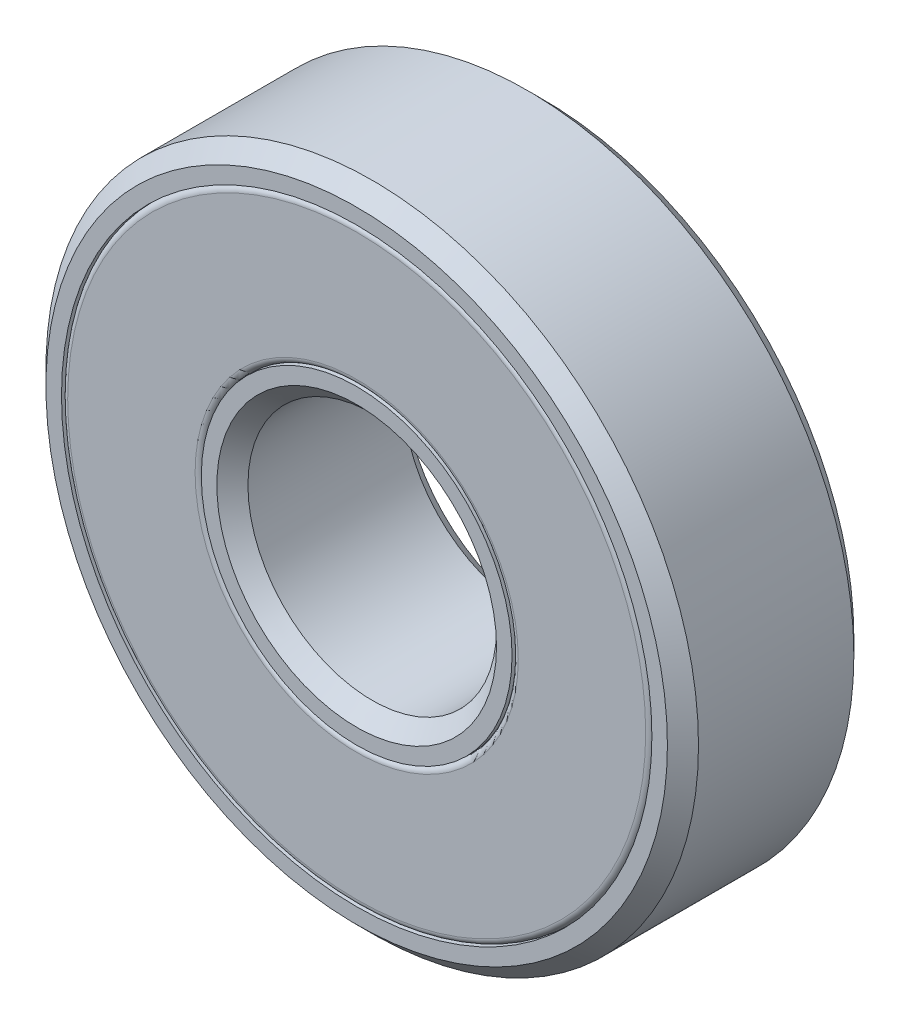
ISO-10303-21;
HEADER;
FILE_DESCRIPTION(('STEP AP214'),'2;1');
FILE_NAME('part.step','',(''),(''),'','','');
FILE_SCHEMA(('AUTOMOTIVE_DESIGN { 1 0 10303 214 1 1 1 1 }'));
ENDSEC;
DATA;
#1=APPLICATION_CONTEXT('core data for automotive mechanical design processes');
#2=APPLICATION_PROTOCOL_DEFINITION('international standard','automotive_design',2000,#1);
#3=PRODUCT_CONTEXT('',#1,'mechanical');
#4=PRODUCT('Part','Part','',(#3));
#5=PRODUCT_RELATED_PRODUCT_CATEGORY('part','',(#4));
#6=PRODUCT_DEFINITION_FORMATION('','',#4);
#7=PRODUCT_DEFINITION_CONTEXT('part definition',#1,'design');
#8=PRODUCT_DEFINITION('design','',#6,#7);
#9=PRODUCT_DEFINITION_SHAPE('','',#8);
#10=(LENGTH_UNIT() NAMED_UNIT(*) SI_UNIT(.MILLI.,.METRE.));
#11=(NAMED_UNIT(*) PLANE_ANGLE_UNIT() SI_UNIT($,.RADIAN.));
#12=(NAMED_UNIT(*) SI_UNIT($,.STERADIAN.) SOLID_ANGLE_UNIT());
#13=UNCERTAINTY_MEASURE_WITH_UNIT(LENGTH_MEASURE(1.E-05),#10,'distance_accuracy_value','');
#14=(GEOMETRIC_REPRESENTATION_CONTEXT(3) GLOBAL_UNCERTAINTY_ASSIGNED_CONTEXT((#13)) GLOBAL_UNIT_ASSIGNED_CONTEXT((#10,
#11,#12)) REPRESENTATION_CONTEXT('',''));
#15=CARTESIAN_POINT('',(0.,0.,0.));
#16=DIRECTION('',(0.,0.,1.));
#17=DIRECTION('',(1.,0.,0.));
#18=AXIS2_PLACEMENT_3D('',#15,#16,#17);
#19=CARTESIAN_POINT('',(0.,0.,6.));
#20=DIRECTION('',(0.,0.,1.));
#21=DIRECTION('',(1.,0.,0.));
#22=AXIS2_PLACEMENT_3D('',#19,#20,#21);
#23=PLANE('',#22);
#24=CARTESIAN_POINT('',(0.,0.,6.));
#25=DIRECTION('',(0.,0.,1.));
#26=DIRECTION('',(1.,0.,0.));
#27=AXIS2_PLACEMENT_3D('',#24,#25,#26);
#28=CIRCLE('',#27,5.2);
#29=CARTESIAN_POINT('',(5.2,0.,6.));
#30=VERTEX_POINT('',#29);
#31=EDGE_CURVE('E69',#30,#30,#28,.F.);
#32=ORIENTED_EDGE('',*,*,#31,.T.);
#33=EDGE_LOOP('',(#32));
#34=FACE_BOUND('',#33,.T.);
#35=CARTESIAN_POINT('',(0.,0.,6.));
#36=DIRECTION('',(0.,0.,1.));
#37=DIRECTION('',(1.,0.,0.));
#38=AXIS2_PLACEMENT_3D('',#35,#36,#37);
#39=CIRCLE('',#38,9.3);
#40=CARTESIAN_POINT('',(9.3,0.,6.));
#41=VERTEX_POINT('',#40);
#42=EDGE_CURVE('E72',#41,#41,#39,.T.);
#43=ORIENTED_EDGE('',*,*,#42,.T.);
#44=EDGE_LOOP('',(#43));
#45=FACE_BOUND('',#44,.T.);
#46=ADVANCED_FACE('F49',(#34,#45),#23,.T.);
#47=CARTESIAN_POINT('',(0.,0.,0.));
#48=DIRECTION('',(0.,0.,1.));
#49=DIRECTION('',(1.,0.,0.));
#50=AXIS2_PLACEMENT_3D('',#47,#48,#49);
#51=PLANE('',#50);
#52=CARTESIAN_POINT('',(0.,0.,0.));
#53=DIRECTION('',(0.,0.,1.));
#54=DIRECTION('',(1.,0.,0.));
#55=AXIS2_PLACEMENT_3D('',#52,#53,#54);
#56=CIRCLE('',#55,5.2);
#57=CARTESIAN_POINT('',(5.2,0.,0.));
#58=VERTEX_POINT('',#57);
#59=EDGE_CURVE('E12',#58,#58,#56,.T.);
#60=ORIENTED_EDGE('',*,*,#59,.T.);
#61=EDGE_LOOP('',(#60));
#62=FACE_BOUND('',#61,.T.);
#63=CARTESIAN_POINT('',(0.,0.,0.));
#64=DIRECTION('',(0.,0.,1.));
#65=DIRECTION('',(1.,0.,0.));
#66=AXIS2_PLACEMENT_3D('',#63,#64,#65);
#67=CIRCLE('',#66,9.3);
#68=CARTESIAN_POINT('',(9.3,0.,0.));
#69=VERTEX_POINT('',#68);
#70=EDGE_CURVE('E56',#69,#69,#67,.F.);
#71=ORIENTED_EDGE('',*,*,#70,.T.);
#72=EDGE_LOOP('',(#71));
#73=FACE_BOUND('',#72,.T.);
#74=ADVANCED_FACE('F97',(#62,#73),#51,.F.);
#75=CARTESIAN_POINT('',(0.,0.,6.));
#76=DIRECTION('',(0.,0.,-1.));
#77=DIRECTION('',(-1.,0.,0.));
#78=AXIS2_PLACEMENT_3D('',#75,#76,#77);
#79=CYLINDRICAL_SURFACE('',#78,9.5);
#80=CARTESIAN_POINT('',(0.,0.,5.8));
#81=DIRECTION('',(0.,0.,1.));
#82=DIRECTION('',(1.,0.,0.));
#83=AXIS2_PLACEMENT_3D('',#80,#81,#82);
#84=CIRCLE('',#83,9.5);
#85=CARTESIAN_POINT('',(9.5,0.,5.8));
#86=VERTEX_POINT('',#85);
#87=EDGE_CURVE('E60',#86,#86,#84,.F.);
#88=ORIENTED_EDGE('',*,*,#87,.T.);
#89=EDGE_LOOP('',(#88));
#90=FACE_BOUND('',#89,.T.);
#91=CARTESIAN_POINT('',(0.,0.,0.2));
#92=DIRECTION('',(0.,0.,1.));
#93=DIRECTION('',(1.,0.,0.));
#94=AXIS2_PLACEMENT_3D('',#91,#92,#93);
#95=CIRCLE('',#94,9.5);
#96=CARTESIAN_POINT('',(9.5,0.,0.2));
#97=VERTEX_POINT('',#96);
#98=EDGE_CURVE('E64',#97,#97,#95,.T.);
#99=ORIENTED_EDGE('',*,*,#98,.T.);
#100=EDGE_LOOP('',(#99));
#101=FACE_BOUND('',#100,.T.);
#102=ADVANCED_FACE('F103',(#90,#101),#79,.T.);
#103=CARTESIAN_POINT('',(0.,0.,6.));
#104=DIRECTION('',(0.,0.,-1.));
#105=DIRECTION('',(-1.,0.,0.));
#106=AXIS2_PLACEMENT_3D('',#103,#104,#105);
#107=CYLINDRICAL_SURFACE('',#106,5.);
#108=CARTESIAN_POINT('',(0.,0.,5.8));
#109=DIRECTION('',(0.,0.,1.));
#110=DIRECTION('',(1.,0.,0.));
#111=AXIS2_PLACEMENT_3D('',#108,#109,#110);
#112=CIRCLE('',#111,5.);
#113=CARTESIAN_POINT('',(5.,0.,5.8));
#114=VERTEX_POINT('',#113);
#115=EDGE_CURVE('E75',#114,#114,#112,.T.);
#116=ORIENTED_EDGE('',*,*,#115,.T.);
#117=EDGE_LOOP('',(#116));
#118=FACE_BOUND('',#117,.T.);
#119=CARTESIAN_POINT('',(0.,0.,0.2));
#120=DIRECTION('',(0.,0.,1.));
#121=DIRECTION('',(1.,0.,0.));
#122=AXIS2_PLACEMENT_3D('',#119,#120,#121);
#123=CIRCLE('',#122,5.);
#124=CARTESIAN_POINT('',(5.,0.,0.2));
#125=VERTEX_POINT('',#124);
#126=EDGE_CURVE('E78',#125,#125,#123,.F.);
#127=ORIENTED_EDGE('',*,*,#126,.T.);
#128=EDGE_LOOP('',(#127));
#129=FACE_BOUND('',#128,.T.);
#130=ADVANCED_FACE('F82',(#118,#129),#107,.F.);
#131=CARTESIAN_POINT('',(0.,0.,5.8));
#132=DIRECTION('',(0.,0.,1.));
#133=DIRECTION('',(1.,0.,0.));
#134=AXIS2_PLACEMENT_3D('',#131,#132,#133);
#135=TOROIDAL_SURFACE('',#134,5.2,0.2);
#136=ORIENTED_EDGE('',*,*,#31,.F.);
#137=EDGE_LOOP('',(#136));
#138=FACE_BOUND('',#137,.T.);
#139=ORIENTED_EDGE('',*,*,#115,.F.);
#140=EDGE_LOOP('',(#139));
#141=FACE_BOUND('',#140,.T.);
#142=ADVANCED_FACE('F93',(#138,#141),#135,.T.);
#143=CARTESIAN_POINT('',(0.,0.,5.8));
#144=DIRECTION('',(0.,0.,1.));
#145=DIRECTION('',(1.,0.,0.));
#146=AXIS2_PLACEMENT_3D('',#143,#144,#145);
#147=TOROIDAL_SURFACE('',#146,9.3,0.2);
#148=ORIENTED_EDGE('',*,*,#87,.F.);
#149=EDGE_LOOP('',(#148));
#150=FACE_BOUND('',#149,.T.);
#151=ORIENTED_EDGE('',*,*,#42,.F.);
#152=EDGE_LOOP('',(#151));
#153=FACE_BOUND('',#152,.T.);
#154=ADVANCED_FACE('F87',(#150,#153),#147,.T.);
#155=CARTESIAN_POINT('',(0.,0.,0.2));
#156=DIRECTION('',(0.,0.,1.));
#157=DIRECTION('',(1.,0.,0.));
#158=AXIS2_PLACEMENT_3D('',#155,#156,#157);
#159=TOROIDAL_SURFACE('',#158,5.2,0.2);
#160=ORIENTED_EDGE('',*,*,#126,.F.);
#161=EDGE_LOOP('',(#160));
#162=FACE_BOUND('',#161,.T.);
#163=ORIENTED_EDGE('',*,*,#59,.F.);
#164=EDGE_LOOP('',(#163));
#165=FACE_BOUND('',#164,.T.);
#166=ADVANCED_FACE('F84',(#162,#165),#159,.T.);
#167=CARTESIAN_POINT('',(0.,0.,0.2));
#168=DIRECTION('',(0.,0.,1.));
#169=DIRECTION('',(1.,0.,0.));
#170=AXIS2_PLACEMENT_3D('',#167,#168,#169);
#171=TOROIDAL_SURFACE('',#170,9.3,0.2);
#172=ORIENTED_EDGE('',*,*,#70,.F.);
#173=EDGE_LOOP('',(#172));
#174=FACE_BOUND('',#173,.T.);
#175=ORIENTED_EDGE('',*,*,#98,.F.);
#176=EDGE_LOOP('',(#175));
#177=FACE_BOUND('',#176,.T.);
#178=ADVANCED_FACE('F51',(#174,#177),#171,.T.);
#179=CLOSED_SHELL('',(#46,#74,#102,#130,#142,#154,#166,#178));
#180=MANIFOLD_SOLID_BREP('B2',#179);
#181=CARTESIAN_POINT('',(0.,0.,6.));
#182=DIRECTION('',(0.,0.,-1.));
#183=DIRECTION('',(-1.,0.,0.));
#184=AXIS2_PLACEMENT_3D('',#181,#182,#183);
#185=CYLINDRICAL_SURFACE('',#184,9.5);
#186=CARTESIAN_POINT('',(0.,0.,6.));
#187=DIRECTION('',(0.,0.,1.));
#188=DIRECTION('',(1.,0.,0.));
#189=AXIS2_PLACEMENT_3D('',#186,#187,#188);
#190=CIRCLE('',#189,9.5);
#191=CARTESIAN_POINT('',(9.5,0.,6.));
#192=VERTEX_POINT('',#191);
#193=EDGE_CURVE('E197',#192,#192,#190,.T.);
#194=ORIENTED_EDGE('',*,*,#193,.T.);
#195=EDGE_LOOP('',(#194));
#196=FACE_BOUND('',#195,.T.);
#197=CARTESIAN_POINT('',(0.,0.,0.));
#198=DIRECTION('',(0.,0.,1.));
#199=DIRECTION('',(1.,0.,0.));
#200=AXIS2_PLACEMENT_3D('',#197,#198,#199);
#201=CIRCLE('',#200,9.5);
#202=CARTESIAN_POINT('',(9.5,0.,0.));
#203=VERTEX_POINT('',#202);
#204=EDGE_CURVE('E198',#203,#203,#201,.T.);
#205=ORIENTED_EDGE('',*,*,#204,.F.);
#206=EDGE_LOOP('',(#205));
#207=FACE_BOUND('',#206,.T.);
#208=ADVANCED_FACE('F177',(#196,#207),#185,.F.);
#209=CARTESIAN_POINT('',(0.,0.,6.));
#210=DIRECTION('',(0.,0.,-1.));
#211=DIRECTION('',(-1.,0.,0.));
#212=AXIS2_PLACEMENT_3D('',#209,#210,#211);
#213=CYLINDRICAL_SURFACE('',#212,10.5);
#214=CARTESIAN_POINT('',(0.,0.,5.49999999999999));
#215=DIRECTION('',(0.,0.,1.));
#216=DIRECTION('',(1.,0.,0.));
#217=AXIS2_PLACEMENT_3D('',#214,#215,#216);
#218=CIRCLE('',#217,10.5);
#219=CARTESIAN_POINT('',(10.5,0.,5.49999999999999));
#220=VERTEX_POINT('',#219);
#221=EDGE_CURVE('E184',#220,#220,#218,.F.);
#222=ORIENTED_EDGE('',*,*,#221,.T.);
#223=EDGE_LOOP('',(#222));
#224=FACE_BOUND('',#223,.T.);
#225=CARTESIAN_POINT('',(0.,0.,0.500000000000002));
#226=DIRECTION('',(0.,0.,1.));
#227=DIRECTION('',(1.,0.,0.));
#228=AXIS2_PLACEMENT_3D('',#225,#226,#227);
#229=CIRCLE('',#228,10.5);
#230=CARTESIAN_POINT('',(10.5,0.,0.500000000000002));
#231=VERTEX_POINT('',#230);
#232=EDGE_CURVE('E188',#231,#231,#229,.T.);
#233=ORIENTED_EDGE('',*,*,#232,.T.);
#234=EDGE_LOOP('',(#233));
#235=FACE_BOUND('',#234,.T.);
#236=ADVANCED_FACE('F209',(#224,#235),#213,.T.);
#237=CARTESIAN_POINT('',(0.,0.,6.));
#238=DIRECTION('',(0.,0.,1.));
#239=DIRECTION('',(1.,0.,0.));
#240=AXIS2_PLACEMENT_3D('',#237,#238,#239);
#241=PLANE('',#240);
#242=CARTESIAN_POINT('',(0.,0.,6.));
#243=DIRECTION('',(0.,0.,1.));
#244=DIRECTION('',(1.,0.,0.));
#245=AXIS2_PLACEMENT_3D('',#242,#243,#244);
#246=CIRCLE('',#245,10.);
#247=CARTESIAN_POINT('',(10.,0.,6.));
#248=VERTEX_POINT('',#247);
#249=EDGE_CURVE('E192',#248,#248,#246,.T.);
#250=ORIENTED_EDGE('',*,*,#249,.T.);
#251=EDGE_LOOP('',(#250));
#252=FACE_BOUND('',#251,.T.);
#253=ORIENTED_EDGE('',*,*,#193,.F.);
#254=EDGE_LOOP('',(#253));
#255=FACE_BOUND('',#254,.T.);
#256=ADVANCED_FACE('F206',(#252,#255),#241,.T.);
#257=CARTESIAN_POINT('',(0.,0.,0.));
#258=DIRECTION('',(0.,0.,1.));
#259=DIRECTION('',(1.,0.,0.));
#260=AXIS2_PLACEMENT_3D('',#257,#258,#259);
#261=PLANE('',#260);
#262=CARTESIAN_POINT('',(0.,0.,0.));
#263=DIRECTION('',(0.,0.,1.));
#264=DIRECTION('',(1.,0.,0.));
#265=AXIS2_PLACEMENT_3D('',#262,#263,#264);
#266=CIRCLE('',#265,10.);
#267=CARTESIAN_POINT('',(10.,0.,0.));
#268=VERTEX_POINT('',#267);
#269=EDGE_CURVE('E48',#268,#268,#266,.F.);
#270=ORIENTED_EDGE('',*,*,#269,.T.);
#271=EDGE_LOOP('',(#270));
#272=FACE_BOUND('',#271,.T.);
#273=ORIENTED_EDGE('',*,*,#204,.T.);
#274=EDGE_LOOP('',(#273));
#275=FACE_BOUND('',#274,.T.);
#276=ADVANCED_FACE('F208',(#272,#275),#261,.F.);
#277=CARTESIAN_POINT('',(0.,0.,6.));
#278=DIRECTION('',(0.,0.,-1.));
#279=DIRECTION('',(-1.,0.,0.));
#280=AXIS2_PLACEMENT_3D('',#277,#278,#279);
#281=CONICAL_SURFACE('',#280,10.,0.785398163397441);
#282=ORIENTED_EDGE('',*,*,#221,.F.);
#283=EDGE_LOOP('',(#282));
#284=FACE_BOUND('',#283,.T.);
#285=ORIENTED_EDGE('',*,*,#249,.F.);
#286=EDGE_LOOP('',(#285));
#287=FACE_BOUND('',#286,.T.);
#288=ADVANCED_FACE('F216',(#284,#287),#281,.T.);
#289=CARTESIAN_POINT('',(0.,0.,0.500000000000002));
#290=DIRECTION('',(0.,0.,1.));
#291=DIRECTION('',(1.,0.,0.));
#292=AXIS2_PLACEMENT_3D('',#289,#290,#291);
#293=CONICAL_SURFACE('',#292,10.5,0.78539816339745);
#294=ORIENTED_EDGE('',*,*,#269,.F.);
#295=EDGE_LOOP('',(#294));
#296=FACE_BOUND('',#295,.T.);
#297=ORIENTED_EDGE('',*,*,#232,.F.);
#298=EDGE_LOOP('',(#297));
#299=FACE_BOUND('',#298,.T.);
#300=ADVANCED_FACE('F179',(#296,#299),#293,.T.);
#301=CLOSED_SHELL('',(#208,#236,#256,#276,#288,#300));
#302=MANIFOLD_SOLID_BREP('B7',#301);
#303=CARTESIAN_POINT('',(0.,0.,6.));
#304=DIRECTION('',(0.,0.,-1.));
#305=DIRECTION('',(-1.,0.,0.));
#306=AXIS2_PLACEMENT_3D('',#303,#304,#305);
#307=CYLINDRICAL_SURFACE('',#306,4.);
#308=CARTESIAN_POINT('',(0.,0.,5.5));
#309=DIRECTION('',(0.,0.,1.));
#310=DIRECTION('',(1.,0.,0.));
#311=AXIS2_PLACEMENT_3D('',#308,#309,#310);
#312=CIRCLE('',#311,4.);
#313=CARTESIAN_POINT('',(4.,0.,5.5));
#314=VERTEX_POINT('',#313);
#315=EDGE_CURVE('E279',#314,#314,#312,.T.);
#316=ORIENTED_EDGE('',*,*,#315,.T.);
#317=EDGE_LOOP('',(#316));
#318=FACE_BOUND('',#317,.T.);
#319=CARTESIAN_POINT('',(0.,0.,0.500000000000003));
#320=DIRECTION('',(0.,0.,1.));
#321=DIRECTION('',(1.,0.,0.));
#322=AXIS2_PLACEMENT_3D('',#319,#320,#321);
#323=CIRCLE('',#322,4.);
#324=CARTESIAN_POINT('',(4.,0.,0.500000000000003));
#325=VERTEX_POINT('',#324);
#326=EDGE_CURVE('E283',#325,#325,#323,.F.);
#327=ORIENTED_EDGE('',*,*,#326,.T.);
#328=EDGE_LOOP('',(#327));
#329=FACE_BOUND('',#328,.T.);
#330=ADVANCED_FACE('F268',(#318,#329),#307,.F.);
#331=CARTESIAN_POINT('',(0.,0.,6.));
#332=DIRECTION('',(0.,0.,-1.));
#333=DIRECTION('',(-1.,0.,0.));
#334=AXIS2_PLACEMENT_3D('',#331,#332,#333);
#335=CYLINDRICAL_SURFACE('',#334,5.);
#336=CARTESIAN_POINT('',(0.,0.,6.));
#337=DIRECTION('',(0.,0.,1.));
#338=DIRECTION('',(1.,0.,0.));
#339=AXIS2_PLACEMENT_3D('',#336,#337,#338);
#340=CIRCLE('',#339,5.);
#341=CARTESIAN_POINT('',(5.,0.,6.));
#342=VERTEX_POINT('',#341);
#343=EDGE_CURVE('E288',#342,#342,#340,.T.);
#344=ORIENTED_EDGE('',*,*,#343,.F.);
#345=EDGE_LOOP('',(#344));
#346=FACE_BOUND('',#345,.T.);
#347=CARTESIAN_POINT('',(0.,0.,0.));
#348=DIRECTION('',(0.,0.,1.));
#349=DIRECTION('',(1.,0.,0.));
#350=AXIS2_PLACEMENT_3D('',#347,#348,#349);
#351=CIRCLE('',#350,5.);
#352=CARTESIAN_POINT('',(5.,0.,0.));
#353=VERTEX_POINT('',#352);
#354=EDGE_CURVE('E289',#353,#353,#351,.T.);
#355=ORIENTED_EDGE('',*,*,#354,.T.);
#356=EDGE_LOOP('',(#355));
#357=FACE_BOUND('',#356,.T.);
#358=ADVANCED_FACE('F297',(#346,#357),#335,.T.);
#359=CARTESIAN_POINT('',(0.,0.,6.));
#360=DIRECTION('',(0.,0.,1.));
#361=DIRECTION('',(1.,0.,0.));
#362=AXIS2_PLACEMENT_3D('',#359,#360,#361);
#363=PLANE('',#362);
#364=CARTESIAN_POINT('',(0.,0.,6.));
#365=DIRECTION('',(0.,0.,1.));
#366=DIRECTION('',(1.,0.,0.));
#367=AXIS2_PLACEMENT_3D('',#364,#365,#366);
#368=CIRCLE('',#367,4.50000000000001);
#369=CARTESIAN_POINT('',(4.50000000000001,0.,6.));
#370=VERTEX_POINT('',#369);
#371=EDGE_CURVE('E275',#370,#370,#368,.F.);
#372=ORIENTED_EDGE('',*,*,#371,.T.);
#373=EDGE_LOOP('',(#372));
#374=FACE_BOUND('',#373,.T.);
#375=ORIENTED_EDGE('',*,*,#343,.T.);
#376=EDGE_LOOP('',(#375));
#377=FACE_BOUND('',#376,.T.);
#378=ADVANCED_FACE('F295',(#374,#377),#363,.T.);
#379=CARTESIAN_POINT('',(0.,0.,0.));
#380=DIRECTION('',(0.,0.,1.));
#381=DIRECTION('',(1.,0.,0.));
#382=AXIS2_PLACEMENT_3D('',#379,#380,#381);
#383=PLANE('',#382);
#384=CARTESIAN_POINT('',(0.,0.,0.));
#385=DIRECTION('',(0.,0.,1.));
#386=DIRECTION('',(1.,0.,0.));
#387=AXIS2_PLACEMENT_3D('',#384,#385,#386);
#388=CIRCLE('',#387,4.5);
#389=CARTESIAN_POINT('',(4.5,0.,0.));
#390=VERTEX_POINT('',#389);
#391=EDGE_CURVE('E176',#390,#390,#388,.T.);
#392=ORIENTED_EDGE('',*,*,#391,.T.);
#393=EDGE_LOOP('',(#392));
#394=FACE_BOUND('',#393,.T.);
#395=ORIENTED_EDGE('',*,*,#354,.F.);
#396=EDGE_LOOP('',(#395));
#397=FACE_BOUND('',#396,.T.);
#398=ADVANCED_FACE('F303',(#394,#397),#383,.F.);
#399=CARTESIAN_POINT('',(0.,0.,5.5));
#400=DIRECTION('',(0.,0.,1.));
#401=DIRECTION('',(1.,0.,0.));
#402=AXIS2_PLACEMENT_3D('',#399,#400,#401);
#403=CONICAL_SURFACE('',#402,4.,0.78539816339745);
#404=ORIENTED_EDGE('',*,*,#371,.F.);
#405=EDGE_LOOP('',(#404));
#406=FACE_BOUND('',#405,.T.);
#407=ORIENTED_EDGE('',*,*,#315,.F.);
#408=EDGE_LOOP('',(#407));
#409=FACE_BOUND('',#408,.T.);
#410=ADVANCED_FACE('F305',(#406,#409),#403,.F.);
#411=CARTESIAN_POINT('',(0.,0.,0.));
#412=DIRECTION('',(0.,0.,-1.));
#413=DIRECTION('',(-1.,0.,0.));
#414=AXIS2_PLACEMENT_3D('',#411,#412,#413);
#415=CONICAL_SURFACE('',#414,4.5,0.785398163397446);
#416=ORIENTED_EDGE('',*,*,#326,.F.);
#417=EDGE_LOOP('',(#416));
#418=FACE_BOUND('',#417,.T.);
#419=ORIENTED_EDGE('',*,*,#391,.F.);
#420=EDGE_LOOP('',(#419));
#421=FACE_BOUND('',#420,.T.);
#422=ADVANCED_FACE('F270',(#418,#421),#415,.F.);
#423=CLOSED_SHELL('',(#330,#358,#378,#398,#410,#422));
#424=MANIFOLD_SOLID_BREP('B43',#423);
#425=ADVANCED_BREP_SHAPE_REPRESENTATION('',(#18,#180,#302,#424),#14);
#426=SHAPE_DEFINITION_REPRESENTATION(#9,#425);
ENDSEC;
END-ISO-10303-21;
